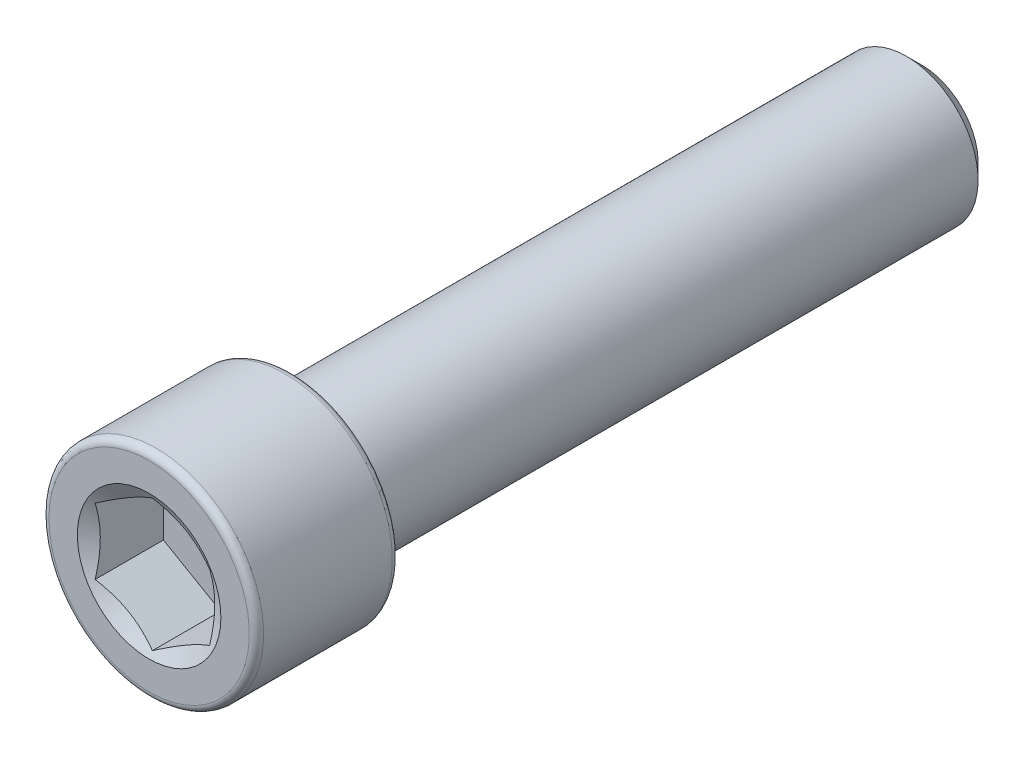
ISO-10303-21;
HEADER;
FILE_DESCRIPTION(('STEP AP214'),'2;1');
FILE_NAME('part.step','',(''),(''),'','','');
FILE_SCHEMA(('AUTOMOTIVE_DESIGN { 1 0 10303 214 1 1 1 1 }'));
ENDSEC;
DATA;
#1=APPLICATION_CONTEXT('core data for automotive mechanical design processes');
#2=APPLICATION_PROTOCOL_DEFINITION('international standard','automotive_design',2000,#1);
#3=PRODUCT_CONTEXT('',#1,'mechanical');
#4=PRODUCT('Part','Part','',(#3));
#5=PRODUCT_RELATED_PRODUCT_CATEGORY('part','',(#4));
#6=PRODUCT_DEFINITION_FORMATION('','',#4);
#7=PRODUCT_DEFINITION_CONTEXT('part definition',#1,'design');
#8=PRODUCT_DEFINITION('design','',#6,#7);
#9=PRODUCT_DEFINITION_SHAPE('','',#8);
#10=(LENGTH_UNIT() NAMED_UNIT(*) SI_UNIT(.MILLI.,.METRE.));
#11=(NAMED_UNIT(*) PLANE_ANGLE_UNIT() SI_UNIT($,.RADIAN.));
#12=(NAMED_UNIT(*) SI_UNIT($,.STERADIAN.) SOLID_ANGLE_UNIT());
#13=UNCERTAINTY_MEASURE_WITH_UNIT(LENGTH_MEASURE(1.E-05),#10,'distance_accuracy_value','');
#14=(GEOMETRIC_REPRESENTATION_CONTEXT(3) GLOBAL_UNCERTAINTY_ASSIGNED_CONTEXT((#13)) GLOBAL_UNIT_ASSIGNED_CONTEXT((#10,
#11,#12)) REPRESENTATION_CONTEXT('',''));
#15=CARTESIAN_POINT('',(0.,0.,0.));
#16=DIRECTION('',(0.,0.,1.));
#17=DIRECTION('',(1.,0.,0.));
#18=AXIS2_PLACEMENT_3D('',#15,#16,#17);
#19=CARTESIAN_POINT('',(0.,0.,-21.43125));
#20=DIRECTION('',(0.,0.,-1.));
#21=DIRECTION('',(-1.,0.,0.));
#22=AXIS2_PLACEMENT_3D('',#19,#20,#21);
#23=PLANE('',#22);
#24=CARTESIAN_POINT('',(0.,0.,-21.43125));
#25=DIRECTION('',(0.,0.,-1.));
#26=DIRECTION('',(-1.,0.,0.));
#27=AXIS2_PLACEMENT_3D('',#24,#25,#26);
#28=CIRCLE('',#27,3.12208333333333);
#29=CARTESIAN_POINT('',(-3.12208333333333,0.,-21.43125));
#30=VERTEX_POINT('',#29);
#31=EDGE_CURVE('E50',#30,#30,#28,.T.);
#32=ORIENTED_EDGE('',*,*,#31,.T.);
#33=EDGE_LOOP('',(#32));
#34=FACE_BOUND('',#33,.T.);
#35=ADVANCED_FACE('F37',(#34),#23,.T.);
#36=CARTESIAN_POINT('',(0.,0.,-21.43125));
#37=DIRECTION('',(0.,0.,1.));
#38=DIRECTION('',(1.,0.,0.));
#39=AXIS2_PLACEMENT_3D('',#36,#37,#38);
#40=CONICAL_SURFACE('',#39,3.12208333333333,0.785398163397449);
#41=CARTESIAN_POINT('',(0.,0.,-20.5845833333333));
#42=DIRECTION('',(0.,0.,-1.));
#43=DIRECTION('',(-1.,0.,0.));
#44=AXIS2_PLACEMENT_3D('',#41,#42,#43);
#45=CIRCLE('',#44,3.96875000000001);
#46=CARTESIAN_POINT('',(-3.96875000000001,0.,-20.5845833333333));
#47=VERTEX_POINT('',#46);
#48=EDGE_CURVE('E135',#47,#47,#45,.T.);
#49=ORIENTED_EDGE('',*,*,#48,.T.);
#50=EDGE_LOOP('',(#49));
#51=FACE_BOUND('',#50,.T.);
#52=ORIENTED_EDGE('',*,*,#31,.F.);
#53=EDGE_LOOP('',(#52));
#54=FACE_BOUND('',#53,.T.);
#55=ADVANCED_FACE('F141',(#51,#54),#40,.T.);
#56=CARTESIAN_POINT('',(0.,0.,-21.43125));
#57=DIRECTION('',(0.,0.,-1.));
#58=DIRECTION('',(-1.,0.,0.));
#59=AXIS2_PLACEMENT_3D('',#56,#57,#58);
#60=CYLINDRICAL_SURFACE('',#59,3.96875000000001);
#61=CARTESIAN_POINT('',(0.,0.,13.49375));
#62=DIRECTION('',(0.,0.,-1.));
#63=DIRECTION('',(-1.,0.,0.));
#64=AXIS2_PLACEMENT_3D('',#61,#62,#63);
#65=CIRCLE('',#64,3.96875);
#66=CARTESIAN_POINT('',(-3.96875,0.,13.49375));
#67=VERTEX_POINT('',#66);
#68=EDGE_CURVE('E132',#67,#67,#65,.T.);
#69=ORIENTED_EDGE('',*,*,#68,.T.);
#70=EDGE_LOOP('',(#69));
#71=FACE_BOUND('',#70,.T.);
#72=ORIENTED_EDGE('',*,*,#48,.F.);
#73=EDGE_LOOP('',(#72));
#74=FACE_BOUND('',#73,.T.);
#75=ADVANCED_FACE('F143',(#71,#74),#60,.T.);
#76=CARTESIAN_POINT('',(0.,3.96875,13.49375));
#77=DIRECTION('',(0.,0.,-1.));
#78=DIRECTION('',(-1.,0.,0.));
#79=AXIS2_PLACEMENT_3D('',#76,#77,#78);
#80=PLANE('',#79);
#81=CARTESIAN_POINT('',(0.,0.,13.49375));
#82=DIRECTION('',(0.,0.,-1.));
#83=DIRECTION('',(-1.,0.,0.));
#84=AXIS2_PLACEMENT_3D('',#81,#82,#83);
#85=CIRCLE('',#84,5.55625);
#86=CARTESIAN_POINT('',(-5.55625,0.,13.49375));
#87=VERTEX_POINT('',#86);
#88=EDGE_CURVE('E129',#87,#87,#85,.T.);
#89=ORIENTED_EDGE('',*,*,#88,.T.);
#90=EDGE_LOOP('',(#89));
#91=FACE_BOUND('',#90,.T.);
#92=ORIENTED_EDGE('',*,*,#68,.F.);
#93=EDGE_LOOP('',(#92));
#94=FACE_BOUND('',#93,.T.);
#95=ADVANCED_FACE('F150',(#91,#94),#80,.T.);
#96=CARTESIAN_POINT('',(0.,0.,13.890625));
#97=DIRECTION('',(0.,0.,-1.));
#98=DIRECTION('',(-1.,0.,0.));
#99=AXIS2_PLACEMENT_3D('',#96,#97,#98);
#100=TOROIDAL_SURFACE('',#99,5.55625,0.396875);
#101=CARTESIAN_POINT('',(0.,0.,13.890625));
#102=DIRECTION('',(0.,0.,-1.));
#103=DIRECTION('',(-1.,0.,0.));
#104=AXIS2_PLACEMENT_3D('',#101,#102,#103);
#105=CIRCLE('',#104,5.953125);
#106=CARTESIAN_POINT('',(-5.953125,0.,13.890625));
#107=VERTEX_POINT('',#106);
#108=EDGE_CURVE('E126',#107,#107,#105,.T.);
#109=ORIENTED_EDGE('',*,*,#108,.T.);
#110=EDGE_LOOP('',(#109));
#111=FACE_BOUND('',#110,.T.);
#112=ORIENTED_EDGE('',*,*,#88,.F.);
#113=EDGE_LOOP('',(#112));
#114=FACE_BOUND('',#113,.T.);
#115=ADVANCED_FACE('F156',(#111,#114),#100,.T.);
#116=CARTESIAN_POINT('',(0.,0.,-21.43125));
#117=DIRECTION('',(0.,0.,-1.));
#118=DIRECTION('',(-1.,0.,0.));
#119=AXIS2_PLACEMENT_3D('',#116,#117,#118);
#120=CYLINDRICAL_SURFACE('',#119,5.953125);
#121=CARTESIAN_POINT('',(0.,0.,21.034375));
#122=DIRECTION('',(0.,0.,-1.));
#123=DIRECTION('',(-1.,0.,0.));
#124=AXIS2_PLACEMENT_3D('',#121,#122,#123);
#125=CIRCLE('',#124,5.953125);
#126=CARTESIAN_POINT('',(-5.953125,0.,21.034375));
#127=VERTEX_POINT('',#126);
#128=EDGE_CURVE('E123',#127,#127,#125,.T.);
#129=ORIENTED_EDGE('',*,*,#128,.T.);
#130=EDGE_LOOP('',(#129));
#131=FACE_BOUND('',#130,.T.);
#132=ORIENTED_EDGE('',*,*,#108,.F.);
#133=EDGE_LOOP('',(#132));
#134=FACE_BOUND('',#133,.T.);
#135=ADVANCED_FACE('F160',(#131,#134),#120,.T.);
#136=CARTESIAN_POINT('',(0.,0.,21.034375));
#137=DIRECTION('',(0.,0.,-1.));
#138=DIRECTION('',(-1.,0.,0.));
#139=AXIS2_PLACEMENT_3D('',#136,#137,#138);
#140=TOROIDAL_SURFACE('',#139,5.55625,0.396875000000001);
#141=CARTESIAN_POINT('',(0.,0.,21.43125));
#142=DIRECTION('',(0.,0.,-1.));
#143=DIRECTION('',(-1.,0.,0.));
#144=AXIS2_PLACEMENT_3D('',#141,#142,#143);
#145=CIRCLE('',#144,5.55625);
#146=CARTESIAN_POINT('',(-5.55625,0.,21.43125));
#147=VERTEX_POINT('',#146);
#148=EDGE_CURVE('E120',#147,#147,#145,.T.);
#149=ORIENTED_EDGE('',*,*,#148,.T.);
#150=EDGE_LOOP('',(#149));
#151=FACE_BOUND('',#150,.T.);
#152=ORIENTED_EDGE('',*,*,#128,.F.);
#153=EDGE_LOOP('',(#152));
#154=FACE_BOUND('',#153,.T.);
#155=ADVANCED_FACE('F164',(#151,#154),#140,.T.);
#156=CARTESIAN_POINT('',(0.,5.55625,21.43125));
#157=DIRECTION('',(0.,0.,1.));
#158=DIRECTION('',(1.,0.,0.));
#159=AXIS2_PLACEMENT_3D('',#156,#157,#158);
#160=PLANE('',#159);
#161=CARTESIAN_POINT('',(0.,0.,21.43125));
#162=DIRECTION('',(0.,0.,1.));
#163=DIRECTION('',(1.,0.,0.));
#164=AXIS2_PLACEMENT_3D('',#161,#162,#163);
#165=CIRCLE('',#164,3.98118684112843);
#166=CARTESIAN_POINT('',(3.98118684112843,0.,21.43125));
#167=VERTEX_POINT('',#166);
#168=EDGE_CURVE('E258',#167,#167,#165,.T.);
#169=ORIENTED_EDGE('',*,*,#168,.F.);
#170=EDGE_LOOP('',(#169));
#171=FACE_BOUND('',#170,.T.);
#172=ORIENTED_EDGE('',*,*,#148,.F.);
#173=EDGE_LOOP('',(#172));
#174=FACE_BOUND('',#173,.T.);
#175=ADVANCED_FACE('F168',(#171,#174),#160,.T.);
#176=CARTESIAN_POINT('',(0.,0.,21.43125));
#177=DIRECTION('',(0.,0.,1.));
#178=DIRECTION('',(1.,0.,0.));
#179=AXIS2_PLACEMENT_3D('',#176,#177,#178);
#180=CONICAL_SURFACE('',#179,3.98118684112843,1.0471975511966);
#181=ORIENTED_EDGE('',*,*,#168,.T.);
#182=EDGE_LOOP('',(#181));
#183=FACE_BOUND('',#182,.T.);
#184=CARTESIAN_POINT('',(3.1752,1.83297163462322,21.2494440420631));
#185=CARTESIAN_POINT('',(3.03567460326018,1.91352665998974,21.2029177442806));
#186=CARTESIAN_POINT('',(2.89494483272887,1.99477703088899,21.1606036751657));
#187=CARTESIAN_POINT('',(2.61104837470026,2.15868472735379,21.0867438189657));
#188=CARTESIAN_POINT('',(2.46787664251628,2.24134496547055,21.0552241611664));
#189=CARTESIAN_POINT('',(2.18330753500983,2.40564101629245,21.0061589152406));
#190=CARTESIAN_POINT('',(2.0419539457708,2.48725154909053,20.9882867771605));
#191=CARTESIAN_POINT('',(1.75858160224329,2.65085664790703,20.9669506242897));
#192=CARTESIAN_POINT('',(1.61656387803407,2.73285061920892,20.9634689418893));
#193=CARTESIAN_POINT('',(1.35119263453263,2.88606277807967,20.9707095109796));
#194=CARTESIAN_POINT('',(1.22779940341379,2.95730389328231,20.979653956401));
#195=CARTESIAN_POINT('',(0.981816852669881,3.09932198517025,21.0080033866258));
#196=CARTESIAN_POINT('',(0.859228383940735,3.17009847059057,21.0274180569673));
#197=CARTESIAN_POINT('',(0.612738605574495,3.31240941048281,21.0759535410686));
#198=CARTESIAN_POINT('',(0.48886849542144,3.38392585192422,21.1052801087302));
#199=CARTESIAN_POINT('',(0.242975839646994,3.52589204292735,21.1718400039195));
#200=CARTESIAN_POINT('',(0.120950143425912,3.59634361148864,21.2090576907073));
#201=CARTESIAN_POINT('',(-0.000200000000000739,3.66628967940796,21.2494440420631));
#202=B_SPLINE_CURVE_WITH_KNOTS('',3,(#184,#185,#186,#187,#188,#189,#190,#191,#192,#193,#194,
#195,#196,#197,#198,#199,#200,#201),.UNSPECIFIED.,.F.,.F.,(4,2,2,2,2,2,2,2,4),(0.,
0.503278731073366,1.00776724301492,1.49976968502821,1.9911679005965,2.41904879402148,
2.84732618162393,3.28510386250597,3.72202181665388),.UNSPECIFIED.);
#203=CARTESIAN_POINT('',(3.175,1.83308710467706,21.249377372247));
#204=VERTEX_POINT('',#203);
#205=CARTESIAN_POINT('',(0.,3.66617420935412,21.249377372247));
#206=VERTEX_POINT('',#205);
#207=EDGE_CURVE('E104',#204,#206,#202,.T.);
#208=ORIENTED_EDGE('',*,*,#207,.F.);
#209=CARTESIAN_POINT('',(3.175,-4.79234251965294,22.4517051228536));
#210=CARTESIAN_POINT('',(3.175,-4.65466073921326,22.3854575566127));
#211=CARTESIAN_POINT('',(3.175,-4.51664823684463,22.3198847550698));
#212=CARTESIAN_POINT('',(3.175,-4.23978523921948,22.1904713282677));
#213=CARTESIAN_POINT('',(3.175,-4.10093460254476,22.126631005917));
#214=CARTESIAN_POINT('',(3.175,-3.82143849603786,22.0007154440901));
#215=CARTESIAN_POINT('',(3.175,-3.6807872636522,21.9386529485991));
#216=CARTESIAN_POINT('',(3.175,-3.3983182348898,21.8172521892569));
#217=CARTESIAN_POINT('',(3.175,-3.2565004984609,21.7579137864306));
#218=CARTESIAN_POINT('',(3.175,-2.96755049061883,21.6410996936439));
#219=CARTESIAN_POINT('',(3.175,-2.82037922345814,21.5837199052249));
#220=CARTESIAN_POINT('',(3.175,-2.52426739226563,21.473630395418));
#221=CARTESIAN_POINT('',(3.175,-2.37532662550385,21.4209212151043));
#222=CARTESIAN_POINT('',(3.175,-2.07576258260937,21.321653125277));
#223=CARTESIAN_POINT('',(3.175,-1.92514388259989,21.2750805529516));
#224=CARTESIAN_POINT('',(3.175,-1.6217524859541,21.1896651625317));
#225=CARTESIAN_POINT('',(3.175,-1.46898052540695,21.1508197684007));
#226=CARTESIAN_POINT('',(3.175,-1.16195790518576,21.0829907508004));
#227=CARTESIAN_POINT('',(3.175,-1.00771727270252,21.0539626098068));
#228=CARTESIAN_POINT('',(3.175,-0.697465262922465,21.0075158550192));
#229=CARTESIAN_POINT('',(3.175,-0.541454021214873,20.9900963582813));
#230=CARTESIAN_POINT('',(3.175,-0.230416690301205,20.9684845051504));
#231=CARTESIAN_POINT('',(3.175,-0.0754019581012914,20.9641326685643));
#232=CARTESIAN_POINT('',(3.175,0.234447517009376,20.9686127211207));
#233=CARTESIAN_POINT('',(3.175,0.389282249246212,20.9774453558036));
#234=CARTESIAN_POINT('',(3.175,0.656148684896118,21.003429793903));
#235=CARTESIAN_POINT('',(3.175,0.768475217331647,21.0176997058146));
#236=CARTESIAN_POINT('',(3.175,0.992212890306474,21.0522156539489));
#237=CARTESIAN_POINT('',(3.175,1.10362388646452,21.0724626148513));
#238=CARTESIAN_POINT('',(3.175,1.43638210348025,21.1410945548276));
#239=CARTESIAN_POINT('',(3.175,1.65611797632086,21.1973556304339));
#240=CARTESIAN_POINT('',(3.175,1.98469837250686,21.2937671225438));
#241=CARTESIAN_POINT('',(3.175,2.09526923538105,21.3283588870325));
#242=CARTESIAN_POINT('',(3.175,2.31533521729636,21.4008401334984));
#243=CARTESIAN_POINT('',(3.175,2.42483032857012,21.4387296392673));
#244=CARTESIAN_POINT('',(3.175,2.6427871573624,21.5172229056842));
#245=CARTESIAN_POINT('',(3.175,2.75124925435168,21.557825621958));
#246=CARTESIAN_POINT('',(3.175,2.9672932019503,21.6412971659105));
#247=CARTESIAN_POINT('',(3.175,3.07487506813827,21.6841659533827));
#248=CARTESIAN_POINT('',(3.175,3.353377739947,21.7979867436612));
#249=CARTESIAN_POINT('',(3.175,3.52370011718585,21.8704012495415));
#250=CARTESIAN_POINT('',(3.175,3.86276530896522,22.0188495655881));
#251=CARTESIAN_POINT('',(3.175,4.0315079935661,22.0948836704127));
#252=CARTESIAN_POINT('',(3.175,4.36775770886018,22.2497417549344));
#253=CARTESIAN_POINT('',(3.175,4.53526440785945,22.3285664528158));
#254=CARTESIAN_POINT('',(3.175,4.86924557230586,22.4883766128521));
#255=CARTESIAN_POINT('',(3.175,5.03572001315238,22.5693621262611));
#256=CARTESIAN_POINT('',(3.175,5.5343078739005,22.8150539315082));
#257=CARTESIAN_POINT('',(3.175,5.86516835812894,22.9823002179446));
#258=CARTESIAN_POINT('',(3.175,6.52458362635422,23.3211237264798));
#259=CARTESIAN_POINT('',(3.175,6.85313876146746,23.4927002699192));
#260=CARTESIAN_POINT('',(3.175,7.47683597131688,23.822039748688));
#261=CARTESIAN_POINT('',(3.175,7.77212434940445,23.979526065264));
#262=CARTESIAN_POINT('',(3.175,8.36175095409403,24.2962971411975));
#263=CARTESIAN_POINT('',(3.175,8.65608913620838,24.4555819832347));
#264=CARTESIAN_POINT('',(3.175,9.24324384386299,24.7750666065514));
#265=CARTESIAN_POINT('',(3.175,9.53606233310217,24.9352627829349));
#266=CARTESIAN_POINT('',(3.175,10.1211053192131,25.2566940301876));
#267=CARTESIAN_POINT('',(3.175,10.4133298515217,25.4179290365325));
#268=CARTESIAN_POINT('',(3.175,10.7053426209343,25.5795441823499));
#269=B_SPLINE_CURVE_WITH_KNOTS('',3,(#209,#210,#211,#212,#213,#214,#215,#216,#217,#218,#219,
#220,#221,#222,#223,#224,#225,#226,#227,#228,#229,#230,#231,#232,#233,#234,#235,#236,#237,#238,
#239,#240,#241,#242,#243,#244,#245,#246,#247,#248,#249,#250,#251,#252,#253,#254,#255,#256,#257,
#258,#259,#260,#261,#262,#263,#264,#265,#266,#267,#268),.UNSPECIFIED.,.F.,.F.,(4,2,2,2,2,2,2,2,
2,2,2,2,2,2,2,2,2,2,2,2,2,2,2,2,2,2,2,2,2,4),(0.,0.458378543438362,0.916836720518569,
1.37801938836483,1.83917850181928,2.3130016953853,2.78687970822348,3.25968415822186,
3.73233072259938,4.20280433870681,4.67324216690097,5.13791486273282,5.60261383533943,
5.94213473814496,6.28170819410582,6.96126545472829,7.30880649889714,7.65635005061062,
8.00376058732205,8.3511649620809,8.90633527693131,9.46155086370961,10.0169103940601,
10.5722831091716,11.6844108891831,12.7963654403263,13.8003363170616,14.8043535365666,
15.8056749903865,16.80693483795),.UNSPECIFIED.);
#270=CARTESIAN_POINT('',(3.175,-1.83308710467706,21.249377372247));
#271=VERTEX_POINT('',#270);
#272=EDGE_CURVE('E214',#271,#204,#269,.T.);
#273=ORIENTED_EDGE('',*,*,#272,.F.);
#274=CARTESIAN_POINT('',(-0.000199999999999701,-3.66628967940796,21.2494440420631));
#275=CARTESIAN_POINT('',(0.139325396739819,-3.58573465404143,21.2029177442806));
#276=CARTESIAN_POINT('',(0.280055167271128,-3.50448428314219,21.1606036751657));
#277=CARTESIAN_POINT('',(0.563951625299741,-3.34057658667739,21.0867438189657));
#278=CARTESIAN_POINT('',(0.707123357483717,-3.25791634856062,21.0552241611664));
#279=CARTESIAN_POINT('',(0.991692464990166,-3.09362029773872,21.0061589152406));
#280=CARTESIAN_POINT('',(1.1330460542292,-3.01200976494065,20.9882867771605));
#281=CARTESIAN_POINT('',(1.4164183977567,-2.84840466612415,20.9669506242897));
#282=CARTESIAN_POINT('',(1.55843612196593,-2.76641069482226,20.9634689418893));
#283=CARTESIAN_POINT('',(1.82380736546737,-2.61319853595151,20.9707095109796));
#284=CARTESIAN_POINT('',(1.94720059658621,-2.54195742074887,20.979653956401));
#285=CARTESIAN_POINT('',(2.19318314733012,-2.39993932886093,21.0080033866258));
#286=CARTESIAN_POINT('',(2.31577161605926,-2.32916284344061,21.0274180569673));
#287=CARTESIAN_POINT('',(2.5622613944255,-2.18685190354837,21.0759535410686));
#288=CARTESIAN_POINT('',(2.68613150457856,-2.11533546210696,21.1052801087302));
#289=CARTESIAN_POINT('',(2.932024160353,-1.97336927110383,21.1718400039195));
#290=CARTESIAN_POINT('',(3.05404985657408,-1.90291770254253,21.2090576907073));
#291=CARTESIAN_POINT('',(3.1752,-1.83297163462322,21.2494440420631));
#292=B_SPLINE_CURVE_WITH_KNOTS('',3,(#274,#275,#276,#277,#278,#279,#280,#281,#282,#283,#284,
#285,#286,#287,#288,#289,#290,#291),.UNSPECIFIED.,.F.,.F.,(4,2,2,2,2,2,2,2,4),(0.,
0.503278731073366,1.00776724301492,1.49976968502821,1.9911679005965,2.41904879402148,
2.84732618162393,3.28510386250597,3.72202181665388),.UNSPECIFIED.);
#293=CARTESIAN_POINT('',(0.,-3.66617420935412,21.249377372247));
#294=VERTEX_POINT('',#293);
#295=EDGE_CURVE('E208',#294,#271,#292,.T.);
#296=ORIENTED_EDGE('',*,*,#295,.F.);
#297=CARTESIAN_POINT('',(-3.1752,-1.83297163462322,21.2494440420631));
#298=CARTESIAN_POINT('',(-3.03567460326018,-1.91352665998975,21.2029177442806));
#299=CARTESIAN_POINT('',(-2.89494483272887,-1.99477703088899,21.1606036751657));
#300=CARTESIAN_POINT('',(-2.61104837470026,-2.15868472735379,21.0867438189657));
#301=CARTESIAN_POINT('',(-2.46787664251628,-2.24134496547056,21.0552241611664));
#302=CARTESIAN_POINT('',(-2.18330753500983,-2.40564101629246,21.0061589152406));
#303=CARTESIAN_POINT('',(-2.0419539457708,-2.48725154909053,20.9882867771605));
#304=CARTESIAN_POINT('',(-1.75858160224329,-2.65085664790703,20.9669506242897));
#305=CARTESIAN_POINT('',(-1.61656387803407,-2.73285061920892,20.9634689418893));
#306=CARTESIAN_POINT('',(-1.35119263453262,-2.88606277807967,20.9707095109796));
#307=CARTESIAN_POINT('',(-1.22779940341379,-2.95730389328231,20.979653956401));
#308=CARTESIAN_POINT('',(-0.981816852669881,-3.09932198517025,21.0080033866258));
#309=CARTESIAN_POINT('',(-0.859228383940735,-3.17009847059057,21.0274180569673));
#310=CARTESIAN_POINT('',(-0.612738605574496,-3.31240941048281,21.0759535410686));
#311=CARTESIAN_POINT('',(-0.48886849542144,-3.38392585192422,21.1052801087302));
#312=CARTESIAN_POINT('',(-0.242975839646994,-3.52589204292735,21.1718400039195));
#313=CARTESIAN_POINT('',(-0.120950143425913,-3.59634361148864,21.2090576907073));
#314=CARTESIAN_POINT('',(0.000199999999999336,-3.66628967940796,21.2494440420631));
#315=B_SPLINE_CURVE_WITH_KNOTS('',3,(#297,#298,#299,#300,#301,#302,#303,#304,#305,#306,#307,
#308,#309,#310,#311,#312,#313,#314),.UNSPECIFIED.,.F.,.F.,(4,2,2,2,2,2,2,2,4),(0.,
0.503278731073366,1.00776724301492,1.49976968502821,1.9911679005965,2.41904879402148,
2.84732618162393,3.28510386250596,3.72202181665388),.UNSPECIFIED.);
#316=CARTESIAN_POINT('',(-3.175,-1.83308710467706,21.249377372247));
#317=VERTEX_POINT('',#316);
#318=EDGE_CURVE('E57',#317,#294,#315,.T.);
#319=ORIENTED_EDGE('',*,*,#318,.F.);
#320=CARTESIAN_POINT('',(-3.175,-4.79234251965294,22.4517051228536));
#321=CARTESIAN_POINT('',(-3.175,-4.65466073921326,22.3854575566127));
#322=CARTESIAN_POINT('',(-3.175,-4.51664823684463,22.3198847550698));
#323=CARTESIAN_POINT('',(-3.175,-4.23978523921948,22.1904713282677));
#324=CARTESIAN_POINT('',(-3.175,-4.10093460254476,22.126631005917));
#325=CARTESIAN_POINT('',(-3.175,-3.82143849603786,22.0007154440901));
#326=CARTESIAN_POINT('',(-3.175,-3.68078726365221,21.9386529485991));
#327=CARTESIAN_POINT('',(-3.175,-3.3983182348898,21.8172521892569));
#328=CARTESIAN_POINT('',(-3.175,-3.25650049846091,21.7579137864306));
#329=CARTESIAN_POINT('',(-3.175,-2.96755049061883,21.6410996936439));
#330=CARTESIAN_POINT('',(-3.175,-2.82037922345815,21.5837199052249));
#331=CARTESIAN_POINT('',(-3.175,-2.52426739226563,21.473630395418));
#332=CARTESIAN_POINT('',(-3.175,-2.37532662550385,21.4209212151043));
#333=CARTESIAN_POINT('',(-3.175,-2.07576258260937,21.321653125277));
#334=CARTESIAN_POINT('',(-3.175,-1.92514388259989,21.2750805529516));
#335=CARTESIAN_POINT('',(-3.175,-1.6217524859541,21.1896651625317));
#336=CARTESIAN_POINT('',(-3.175,-1.46898052540695,21.1508197684007));
#337=CARTESIAN_POINT('',(-3.175,-1.16195790518576,21.0829907508004));
#338=CARTESIAN_POINT('',(-3.175,-1.00771727270252,21.0539626098068));
#339=CARTESIAN_POINT('',(-3.175,-0.697465262922467,21.0075158550192));
#340=CARTESIAN_POINT('',(-3.175,-0.541454021214874,20.9900963582813));
#341=CARTESIAN_POINT('',(-3.175,-0.230416690301206,20.9684845051504));
#342=CARTESIAN_POINT('',(-3.175,-0.0754019581012916,20.9641326685643));
#343=CARTESIAN_POINT('',(-3.175,0.234447517009377,20.9686127211207));
#344=CARTESIAN_POINT('',(-3.175,0.389282249246212,20.9774453558036));
#345=CARTESIAN_POINT('',(-3.175,0.656148684896119,21.003429793903));
#346=CARTESIAN_POINT('',(-3.175,0.768475217331648,21.0176997058146));
#347=CARTESIAN_POINT('',(-3.175,0.992212890306476,21.0522156539489));
#348=CARTESIAN_POINT('',(-3.175,1.10362388646452,21.0724626148513));
#349=CARTESIAN_POINT('',(-3.175,1.43638210348025,21.1410945548276));
#350=CARTESIAN_POINT('',(-3.175,1.65611797632087,21.1973556304339));
#351=CARTESIAN_POINT('',(-3.175,1.98469837250687,21.2937671225438));
#352=CARTESIAN_POINT('',(-3.175,2.09526923538105,21.3283588870325));
#353=CARTESIAN_POINT('',(-3.175,2.31533521729636,21.4008401334984));
#354=CARTESIAN_POINT('',(-3.175,2.42483032857013,21.4387296392673));
#355=CARTESIAN_POINT('',(-3.175,2.6427871573624,21.5172229056842));
#356=CARTESIAN_POINT('',(-3.175,2.75124925435168,21.557825621958));
#357=CARTESIAN_POINT('',(-3.175,2.9672932019503,21.6412971659105));
#358=CARTESIAN_POINT('',(-3.175,3.07487506813828,21.6841659533827));
#359=CARTESIAN_POINT('',(-3.175,3.353377739947,21.7979867436612));
#360=CARTESIAN_POINT('',(-3.175,3.52370011718585,21.8704012495415));
#361=CARTESIAN_POINT('',(-3.175,3.86276530896522,22.0188495655881));
#362=CARTESIAN_POINT('',(-3.175,4.0315079935661,22.0948836704127));
#363=CARTESIAN_POINT('',(-3.175,4.36775770886019,22.2497417549344));
#364=CARTESIAN_POINT('',(-3.175,4.53526440785946,22.3285664528158));
#365=CARTESIAN_POINT('',(-3.175,4.86924557230586,22.4883766128521));
#366=CARTESIAN_POINT('',(-3.175,5.03572001315238,22.5693621262611));
#367=CARTESIAN_POINT('',(-3.175,5.5343078739005,22.8150539315082));
#368=CARTESIAN_POINT('',(-3.175,5.86516835812895,22.9823002179446));
#369=CARTESIAN_POINT('',(-3.175,6.52458362635422,23.3211237264798));
#370=CARTESIAN_POINT('',(-3.175,6.85313876146747,23.4927002699192));
#371=CARTESIAN_POINT('',(-3.175,7.47683597131688,23.822039748688));
#372=CARTESIAN_POINT('',(-3.175,7.77212434940445,23.979526065264));
#373=CARTESIAN_POINT('',(-3.175,8.36175095409404,24.2962971411975));
#374=CARTESIAN_POINT('',(-3.175,8.65608913620839,24.4555819832347));
#375=CARTESIAN_POINT('',(-3.175,9.243243843863,24.7750666065514));
#376=CARTESIAN_POINT('',(-3.175,9.53606233310218,24.9352627829349));
#377=CARTESIAN_POINT('',(-3.175,10.1211053192131,25.2566940301876));
#378=CARTESIAN_POINT('',(-3.175,10.4133298515217,25.4179290365325));
#379=CARTESIAN_POINT('',(-3.175,10.7053426209343,25.5795441823499));
#380=B_SPLINE_CURVE_WITH_KNOTS('',3,(#320,#321,#322,#323,#324,#325,#326,#327,#328,#329,#330,
#331,#332,#333,#334,#335,#336,#337,#338,#339,#340,#341,#342,#343,#344,#345,#346,#347,#348,#349,
#350,#351,#352,#353,#354,#355,#356,#357,#358,#359,#360,#361,#362,#363,#364,#365,#366,#367,#368,
#369,#370,#371,#372,#373,#374,#375,#376,#377,#378,#379),.UNSPECIFIED.,.F.,.F.,(4,2,2,2,2,2,2,2,
2,2,2,2,2,2,2,2,2,2,2,2,2,2,2,2,2,2,2,2,2,4),(0.,0.458378543438362,0.916836720518567,
1.37801938836482,1.83917850181927,2.3130016953853,2.78687970822348,3.25968415822186,
3.73233072259937,4.20280433870681,4.67324216690097,5.13791486273282,5.60261383533943,
5.94213473814496,6.28170819410582,6.96126545472829,7.30880649889714,7.65635005061062,
8.00376058732205,8.35116496208091,8.90633527693131,9.46155086370961,10.0169103940601,
10.5722831091716,11.6844108891831,12.7963654403263,13.8003363170616,14.8043535365666,
15.8056749903865,16.80693483795),.UNSPECIFIED.);
#381=CARTESIAN_POINT('',(-3.175,1.83308710467706,21.249377372247));
#382=VERTEX_POINT('',#381);
#383=EDGE_CURVE('E11',#382,#317,#380,.F.);
#384=ORIENTED_EDGE('',*,*,#383,.F.);
#385=CARTESIAN_POINT('',(0.000199999999998573,3.66628967940796,21.2494440420631));
#386=CARTESIAN_POINT('',(-0.13932539673982,3.58573465404143,21.2029177442806));
#387=CARTESIAN_POINT('',(-0.28005516727113,3.50448428314219,21.1606036751657));
#388=CARTESIAN_POINT('',(-0.563951625299743,3.34057658667739,21.0867438189657));
#389=CARTESIAN_POINT('',(-0.707123357483718,3.25791634856062,21.0552241611664));
#390=CARTESIAN_POINT('',(-0.991692464990167,3.09362029773872,21.0061589152406));
#391=CARTESIAN_POINT('',(-1.1330460542292,3.01200976494065,20.9882867771605));
#392=CARTESIAN_POINT('',(-1.41641839775671,2.84840466612415,20.9669506242897));
#393=CARTESIAN_POINT('',(-1.55843612196593,2.76641069482226,20.9634689418893));
#394=CARTESIAN_POINT('',(-1.82380736546737,2.61319853595151,20.9707095109796));
#395=CARTESIAN_POINT('',(-1.94720059658621,2.54195742074887,20.979653956401));
#396=CARTESIAN_POINT('',(-2.19318314733012,2.39993932886093,21.0080033866258));
#397=CARTESIAN_POINT('',(-2.31577161605926,2.32916284344061,21.0274180569673));
#398=CARTESIAN_POINT('',(-2.5622613944255,2.18685190354837,21.0759535410686));
#399=CARTESIAN_POINT('',(-2.68613150457856,2.11533546210695,21.1052801087302));
#400=CARTESIAN_POINT('',(-2.932024160353,1.97336927110383,21.1718400039195));
#401=CARTESIAN_POINT('',(-3.05404985657408,1.90291770254253,21.2090576907073));
#402=CARTESIAN_POINT('',(-3.1752,1.83297163462322,21.2494440420631));
#403=B_SPLINE_CURVE_WITH_KNOTS('',3,(#385,#386,#387,#388,#389,#390,#391,#392,#393,#394,#395,
#396,#397,#398,#399,#400,#401,#402),.UNSPECIFIED.,.F.,.F.,(4,2,2,2,2,2,2,2,4),(0.,
0.503278731073367,1.00776724301492,1.49976968502821,1.9911679005965,2.41904879402148,
2.84732618162393,3.28510386250596,3.72202181665388),.UNSPECIFIED.);
#404=EDGE_CURVE('E95',#206,#382,#403,.T.);
#405=ORIENTED_EDGE('',*,*,#404,.F.);
#406=EDGE_LOOP('',(#208,#273,#296,#319,#384,#405));
#407=FACE_BOUND('',#406,.T.);
#408=ADVANCED_FACE('F94',(#183,#407),#180,.F.);
#409=CARTESIAN_POINT('',(0.,0.,17.4625));
#410=DIRECTION('',(0.,0.,1.));
#411=DIRECTION('',(1.,0.,0.));
#412=AXIS2_PLACEMENT_3D('',#409,#410,#411);
#413=PLANE('',#412);
#414=DIRECTION('',(-0.866025403784438,-0.5,0.));
#415=VECTOR('',#414,1.);
#416=CARTESIAN_POINT('',(0.,3.66617420935412,17.4625));
#417=LINE('',#416,#415);
#418=CARTESIAN_POINT('',(0.,3.66617420935412,17.4625));
#419=VERTEX_POINT('',#418);
#420=CARTESIAN_POINT('',(-3.175,1.83308710467706,17.4625));
#421=VERTEX_POINT('',#420);
#422=EDGE_CURVE('E103',#419,#421,#417,.T.);
#423=ORIENTED_EDGE('',*,*,#422,.T.);
#424=DIRECTION('',(0.,-1.,0.));
#425=VECTOR('',#424,1.);
#426=CARTESIAN_POINT('',(-3.175,1.83308710467706,17.4625));
#427=LINE('',#426,#425);
#428=CARTESIAN_POINT('',(-3.175,-1.83308710467706,17.4625));
#429=VERTEX_POINT('',#428);
#430=EDGE_CURVE('E108',#421,#429,#427,.T.);
#431=ORIENTED_EDGE('',*,*,#430,.T.);
#432=DIRECTION('',(0.866025403784439,-0.5,0.));
#433=VECTOR('',#432,1.);
#434=CARTESIAN_POINT('',(-3.175,-1.83308710467706,17.4625));
#435=LINE('',#434,#433);
#436=CARTESIAN_POINT('',(0.,-3.66617420935412,17.4625));
#437=VERTEX_POINT('',#436);
#438=EDGE_CURVE('E240',#429,#437,#435,.T.);
#439=ORIENTED_EDGE('',*,*,#438,.T.);
#440=DIRECTION('',(0.866025403784439,0.5,0.));
#441=VECTOR('',#440,1.);
#442=CARTESIAN_POINT('',(0.,-3.66617420935412,17.4625));
#443=LINE('',#442,#441);
#444=CARTESIAN_POINT('',(3.175,-1.83308710467706,17.4625));
#445=VERTEX_POINT('',#444);
#446=EDGE_CURVE('E244',#437,#445,#443,.T.);
#447=ORIENTED_EDGE('',*,*,#446,.T.);
#448=DIRECTION('',(0.,1.,0.));
#449=VECTOR('',#448,1.);
#450=CARTESIAN_POINT('',(3.175,-1.83308710467706,17.4625));
#451=LINE('',#450,#449);
#452=CARTESIAN_POINT('',(3.175,1.83308710467706,17.4625));
#453=VERTEX_POINT('',#452);
#454=EDGE_CURVE('E116',#445,#453,#451,.T.);
#455=ORIENTED_EDGE('',*,*,#454,.T.);
#456=DIRECTION('',(-0.866025403784439,0.5,0.));
#457=VECTOR('',#456,1.);
#458=CARTESIAN_POINT('',(3.175,1.83308710467706,17.4625));
#459=LINE('',#458,#457);
#460=EDGE_CURVE('E111',#453,#419,#459,.T.);
#461=ORIENTED_EDGE('',*,*,#460,.T.);
#462=EDGE_LOOP('',(#423,#431,#439,#447,#455,#461));
#463=FACE_BOUND('',#462,.T.);
#464=ADVANCED_FACE('F194',(#463),#413,.T.);
#465=CARTESIAN_POINT('',(-3.175,1.83308710467706,17.4625));
#466=DIRECTION('',(-1.,0.,0.));
#467=DIRECTION('',(0.,0.,1.));
#468=AXIS2_PLACEMENT_3D('',#465,#466,#467);
#469=PLANE('',#468);
#470=DIRECTION('',(0.,0.,1.));
#471=VECTOR('',#470,1.);
#472=CARTESIAN_POINT('',(-3.175,1.83308710467706,17.4625));
#473=LINE('',#472,#471);
#474=EDGE_CURVE('E101',#421,#382,#473,.T.);
#475=ORIENTED_EDGE('',*,*,#474,.T.);
#476=ORIENTED_EDGE('',*,*,#383,.T.);
#477=DIRECTION('',(0.,0.,1.));
#478=VECTOR('',#477,1.);
#479=CARTESIAN_POINT('',(-3.175,-1.83308710467706,17.4625));
#480=LINE('',#479,#478);
#481=EDGE_CURVE('E110',#429,#317,#480,.T.);
#482=ORIENTED_EDGE('',*,*,#481,.F.);
#483=ORIENTED_EDGE('',*,*,#430,.F.);
#484=EDGE_LOOP('',(#475,#476,#482,#483));
#485=FACE_BOUND('',#484,.T.);
#486=ADVANCED_FACE('F106',(#485),#469,.F.);
#487=CARTESIAN_POINT('',(-3.175,-1.83308710467706,17.4625));
#488=DIRECTION('',(-0.5,-0.866025403784439,0.));
#489=DIRECTION('',(0.866025403784439,-0.5,0.));
#490=AXIS2_PLACEMENT_3D('',#487,#488,#489);
#491=PLANE('',#490);
#492=ORIENTED_EDGE('',*,*,#481,.T.);
#493=ORIENTED_EDGE('',*,*,#318,.T.);
#494=DIRECTION('',(0.,0.,1.));
#495=VECTOR('',#494,1.);
#496=CARTESIAN_POINT('',(0.,-3.66617420935412,17.4625));
#497=LINE('',#496,#495);
#498=EDGE_CURVE('E113',#437,#294,#497,.T.);
#499=ORIENTED_EDGE('',*,*,#498,.F.);
#500=ORIENTED_EDGE('',*,*,#438,.F.);
#501=EDGE_LOOP('',(#492,#493,#499,#500));
#502=FACE_BOUND('',#501,.T.);
#503=ADVANCED_FACE('F229',(#502),#491,.F.);
#504=CARTESIAN_POINT('',(0.,-3.66617420935412,17.4625));
#505=DIRECTION('',(0.5,-0.866025403784439,0.));
#506=DIRECTION('',(0.866025403784439,0.5,0.));
#507=AXIS2_PLACEMENT_3D('',#504,#505,#506);
#508=PLANE('',#507);
#509=ORIENTED_EDGE('',*,*,#498,.T.);
#510=ORIENTED_EDGE('',*,*,#295,.T.);
#511=DIRECTION('',(0.,0.,1.));
#512=VECTOR('',#511,1.);
#513=CARTESIAN_POINT('',(3.175,-1.83308710467706,17.4625));
#514=LINE('',#513,#512);
#515=EDGE_CURVE('E254',#445,#271,#514,.T.);
#516=ORIENTED_EDGE('',*,*,#515,.F.);
#517=ORIENTED_EDGE('',*,*,#446,.F.);
#518=EDGE_LOOP('',(#509,#510,#516,#517));
#519=FACE_BOUND('',#518,.T.);
#520=ADVANCED_FACE('F224',(#519),#508,.F.);
#521=CARTESIAN_POINT('',(3.175,-1.83308710467706,17.4625));
#522=DIRECTION('',(1.,0.,0.));
#523=DIRECTION('',(0.,0.,-1.));
#524=AXIS2_PLACEMENT_3D('',#521,#522,#523);
#525=PLANE('',#524);
#526=ORIENTED_EDGE('',*,*,#515,.T.);
#527=ORIENTED_EDGE('',*,*,#272,.T.);
#528=DIRECTION('',(0.,0.,1.));
#529=VECTOR('',#528,1.);
#530=CARTESIAN_POINT('',(3.175,1.83308710467706,17.4625));
#531=LINE('',#530,#529);
#532=EDGE_CURVE('E251',#453,#204,#531,.T.);
#533=ORIENTED_EDGE('',*,*,#532,.F.);
#534=ORIENTED_EDGE('',*,*,#454,.F.);
#535=EDGE_LOOP('',(#526,#527,#533,#534));
#536=FACE_BOUND('',#535,.T.);
#537=ADVANCED_FACE('F221',(#536),#525,.F.);
#538=CARTESIAN_POINT('',(3.175,1.83308710467706,17.4625));
#539=DIRECTION('',(0.5,0.866025403784439,0.));
#540=DIRECTION('',(-0.866025403784439,0.5,0.));
#541=AXIS2_PLACEMENT_3D('',#538,#539,#540);
#542=PLANE('',#541);
#543=ORIENTED_EDGE('',*,*,#532,.T.);
#544=ORIENTED_EDGE('',*,*,#207,.T.);
#545=DIRECTION('',(0.,0.,1.));
#546=VECTOR('',#545,1.);
#547=CARTESIAN_POINT('',(0.,3.66617420935412,17.4625));
#548=LINE('',#547,#546);
#549=EDGE_CURVE('E64',#419,#206,#548,.T.);
#550=ORIENTED_EDGE('',*,*,#549,.F.);
#551=ORIENTED_EDGE('',*,*,#460,.F.);
#552=EDGE_LOOP('',(#543,#544,#550,#551));
#553=FACE_BOUND('',#552,.T.);
#554=ADVANCED_FACE('F175',(#553),#542,.F.);
#555=CARTESIAN_POINT('',(0.,3.66617420935412,17.4625));
#556=DIRECTION('',(-0.5,0.866025403784438,0.));
#557=DIRECTION('',(-0.866025403784439,-0.5,0.));
#558=AXIS2_PLACEMENT_3D('',#555,#556,#557);
#559=PLANE('',#558);
#560=ORIENTED_EDGE('',*,*,#549,.T.);
#561=ORIENTED_EDGE('',*,*,#404,.T.);
#562=ORIENTED_EDGE('',*,*,#474,.F.);
#563=ORIENTED_EDGE('',*,*,#422,.F.);
#564=EDGE_LOOP('',(#560,#561,#562,#563));
#565=FACE_BOUND('',#564,.T.);
#566=ADVANCED_FACE('F100',(#565),#559,.F.);
#567=CLOSED_SHELL('',(#35,#55,#75,#95,#115,#135,#155,#175,#408,#464,#486,#503,#520,#537,#554,#566));
#568=MANIFOLD_SOLID_BREP('B2',#567);
#569=ADVANCED_BREP_SHAPE_REPRESENTATION('',(#18,#568),#14);
#570=SHAPE_DEFINITION_REPRESENTATION(#9,#569);
ENDSEC;
END-ISO-10303-21;
